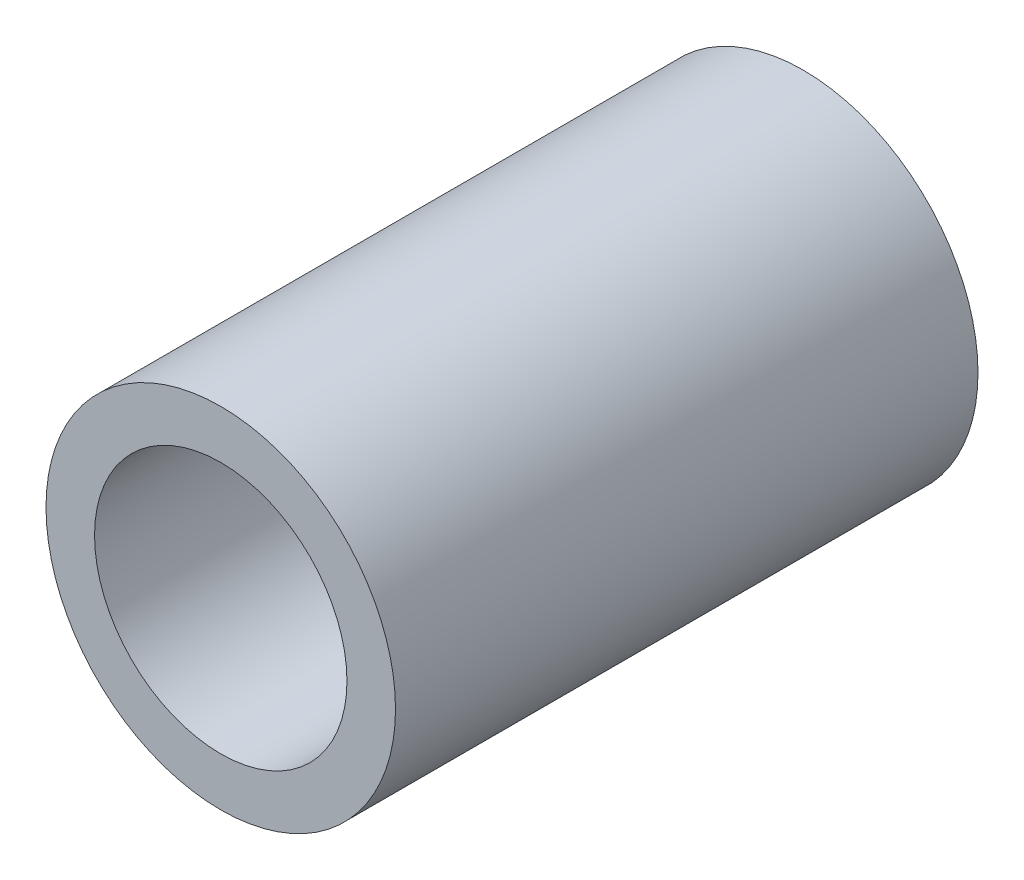
ISO-10303-21;
HEADER;
FILE_DESCRIPTION(('STEP AP214'),'2;1');
FILE_NAME('part.step','',(''),(''),'','','');
FILE_SCHEMA(('AUTOMOTIVE_DESIGN { 1 0 10303 214 1 1 1 1 }'));
ENDSEC;
DATA;
#1=APPLICATION_CONTEXT('core data for automotive mechanical design processes');
#2=APPLICATION_PROTOCOL_DEFINITION('international standard','automotive_design',2000,#1);
#3=PRODUCT_CONTEXT('',#1,'mechanical');
#4=PRODUCT('Part','Part','',(#3));
#5=PRODUCT_RELATED_PRODUCT_CATEGORY('part','',(#4));
#6=PRODUCT_DEFINITION_FORMATION('','',#4);
#7=PRODUCT_DEFINITION_CONTEXT('part definition',#1,'design');
#8=PRODUCT_DEFINITION('design','',#6,#7);
#9=PRODUCT_DEFINITION_SHAPE('','',#8);
#10=(LENGTH_UNIT() NAMED_UNIT(*) SI_UNIT(.MILLI.,.METRE.));
#11=(NAMED_UNIT(*) PLANE_ANGLE_UNIT() SI_UNIT($,.RADIAN.));
#12=(NAMED_UNIT(*) SI_UNIT($,.STERADIAN.) SOLID_ANGLE_UNIT());
#13=UNCERTAINTY_MEASURE_WITH_UNIT(LENGTH_MEASURE(1.E-05),#10,'distance_accuracy_value','');
#14=(GEOMETRIC_REPRESENTATION_CONTEXT(3) GLOBAL_UNCERTAINTY_ASSIGNED_CONTEXT((#13)) GLOBAL_UNIT_ASSIGNED_CONTEXT((#10,
#11,#12)) REPRESENTATION_CONTEXT('',''));
#15=CARTESIAN_POINT('',(0.,0.,0.));
#16=DIRECTION('',(0.,0.,1.));
#17=DIRECTION('',(1.,0.,0.));
#18=AXIS2_PLACEMENT_3D('',#15,#16,#17);
#19=CARTESIAN_POINT('',(0.,0.,15.));
#20=DIRECTION('',(0.,0.,1.));
#21=DIRECTION('',(1.,0.,0.));
#22=AXIS2_PLACEMENT_3D('',#19,#20,#21);
#23=PLANE('',#22);
#24=CARTESIAN_POINT('',(0.,0.,15.));
#25=DIRECTION('',(0.,0.,1.));
#26=DIRECTION('',(1.,0.,0.));
#27=AXIS2_PLACEMENT_3D('',#24,#25,#26);
#28=CIRCLE('',#27,4.5);
#29=CARTESIAN_POINT('',(4.5,0.,15.));
#30=VERTEX_POINT('',#29);
#31=EDGE_CURVE('E10',#30,#30,#28,.T.);
#32=ORIENTED_EDGE('',*,*,#31,.T.);
#33=EDGE_LOOP('',(#32));
#34=FACE_BOUND('',#33,.T.);
#35=CARTESIAN_POINT('',(0.,0.,15.));
#36=DIRECTION('',(0.,0.,1.));
#37=DIRECTION('',(1.,0.,0.));
#38=AXIS2_PLACEMENT_3D('',#35,#36,#37);
#39=CIRCLE('',#38,3.25);
#40=CARTESIAN_POINT('',(3.25,0.,15.));
#41=VERTEX_POINT('',#40);
#42=EDGE_CURVE('E41',#41,#41,#39,.T.);
#43=ORIENTED_EDGE('',*,*,#42,.F.);
#44=EDGE_LOOP('',(#43));
#45=FACE_BOUND('',#44,.T.);
#46=ADVANCED_FACE('F30',(#34,#45),#23,.T.);
#47=CARTESIAN_POINT('',(0.,0.,0.));
#48=DIRECTION('',(0.,0.,1.));
#49=DIRECTION('',(1.,0.,0.));
#50=AXIS2_PLACEMENT_3D('',#47,#48,#49);
#51=PLANE('',#50);
#52=CARTESIAN_POINT('',(0.,0.,0.));
#53=DIRECTION('',(0.,0.,1.));
#54=DIRECTION('',(1.,0.,0.));
#55=AXIS2_PLACEMENT_3D('',#52,#53,#54);
#56=CIRCLE('',#55,4.5);
#57=CARTESIAN_POINT('',(4.5,0.,0.));
#58=VERTEX_POINT('',#57);
#59=EDGE_CURVE('E34',#58,#58,#56,.T.);
#60=ORIENTED_EDGE('',*,*,#59,.F.);
#61=EDGE_LOOP('',(#60));
#62=FACE_BOUND('',#61,.T.);
#63=CARTESIAN_POINT('',(0.,0.,0.));
#64=DIRECTION('',(0.,0.,1.));
#65=DIRECTION('',(1.,0.,0.));
#66=AXIS2_PLACEMENT_3D('',#63,#64,#65);
#67=CIRCLE('',#66,3.25);
#68=CARTESIAN_POINT('',(3.25,0.,0.));
#69=VERTEX_POINT('',#68);
#70=EDGE_CURVE('E43',#69,#69,#67,.T.);
#71=ORIENTED_EDGE('',*,*,#70,.T.);
#72=EDGE_LOOP('',(#71));
#73=FACE_BOUND('',#72,.T.);
#74=ADVANCED_FACE('F53',(#62,#73),#51,.F.);
#75=CARTESIAN_POINT('',(0.,0.,15.));
#76=DIRECTION('',(0.,0.,-1.));
#77=DIRECTION('',(-1.,0.,0.));
#78=AXIS2_PLACEMENT_3D('',#75,#76,#77);
#79=CYLINDRICAL_SURFACE('',#78,4.5);
#80=ORIENTED_EDGE('',*,*,#31,.F.);
#81=EDGE_LOOP('',(#80));
#82=FACE_BOUND('',#81,.T.);
#83=ORIENTED_EDGE('',*,*,#59,.T.);
#84=EDGE_LOOP('',(#83));
#85=FACE_BOUND('',#84,.T.);
#86=ADVANCED_FACE('F32',(#82,#85),#79,.T.);
#87=CARTESIAN_POINT('',(0.,0.,15.));
#88=DIRECTION('',(0.,0.,-1.));
#89=DIRECTION('',(-1.,0.,0.));
#90=AXIS2_PLACEMENT_3D('',#87,#88,#89);
#91=CYLINDRICAL_SURFACE('',#90,3.25);
#92=ORIENTED_EDGE('',*,*,#42,.T.);
#93=EDGE_LOOP('',(#92));
#94=FACE_BOUND('',#93,.T.);
#95=ORIENTED_EDGE('',*,*,#70,.F.);
#96=EDGE_LOOP('',(#95));
#97=FACE_BOUND('',#96,.T.);
#98=ADVANCED_FACE('F49',(#94,#97),#91,.F.);
#99=CLOSED_SHELL('',(#46,#74,#86,#98));
#100=MANIFOLD_SOLID_BREP('B2',#99);
#101=ADVANCED_BREP_SHAPE_REPRESENTATION('',(#18,#100),#14);
#102=SHAPE_DEFINITION_REPRESENTATION(#9,#101);
ENDSEC;
END-ISO-10303-21;
